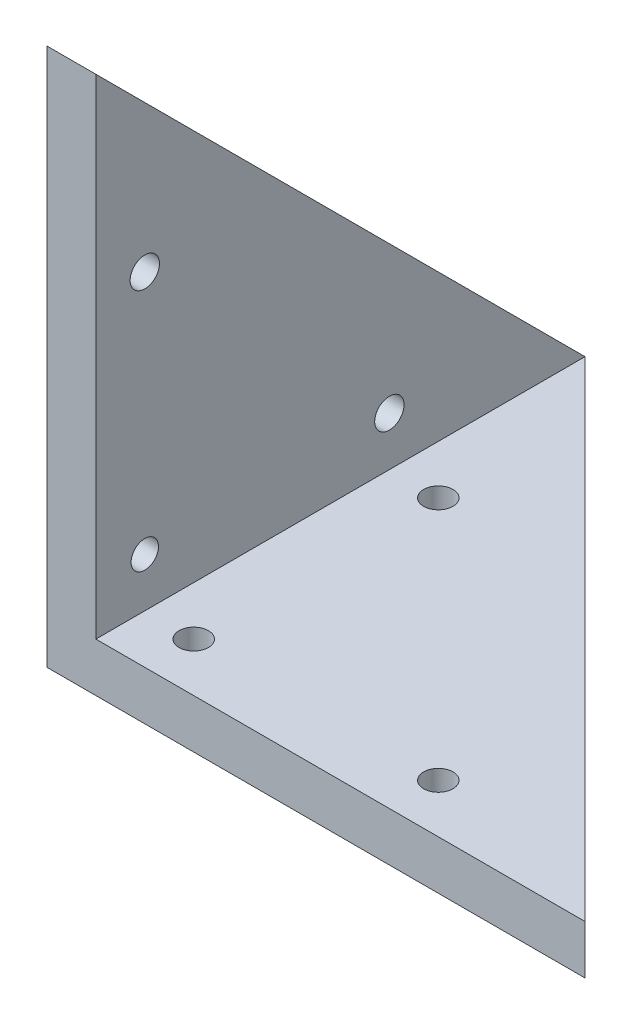
ISO-10303-21;
HEADER;
FILE_DESCRIPTION(('STEP AP214'),'2;1');
FILE_NAME('part.step','',(''),(''),'','','');
FILE_SCHEMA(('AUTOMOTIVE_DESIGN { 1 0 10303 214 1 1 1 1 }'));
ENDSEC;
DATA;
#1=APPLICATION_CONTEXT('core data for automotive mechanical design processes');
#2=APPLICATION_PROTOCOL_DEFINITION('international standard','automotive_design',2000,#1);
#3=PRODUCT_CONTEXT('',#1,'mechanical');
#4=PRODUCT('Part','Part','',(#3));
#5=PRODUCT_RELATED_PRODUCT_CATEGORY('part','',(#4));
#6=PRODUCT_DEFINITION_FORMATION('','',#4);
#7=PRODUCT_DEFINITION_CONTEXT('part definition',#1,'design');
#8=PRODUCT_DEFINITION('design','',#6,#7);
#9=PRODUCT_DEFINITION_SHAPE('','',#8);
#10=(LENGTH_UNIT() NAMED_UNIT(*) SI_UNIT(.MILLI.,.METRE.));
#11=(NAMED_UNIT(*) PLANE_ANGLE_UNIT() SI_UNIT($,.RADIAN.));
#12=(NAMED_UNIT(*) SI_UNIT($,.STERADIAN.) SOLID_ANGLE_UNIT());
#13=UNCERTAINTY_MEASURE_WITH_UNIT(LENGTH_MEASURE(1.E-05),#10,'distance_accuracy_value','');
#14=(GEOMETRIC_REPRESENTATION_CONTEXT(3) GLOBAL_UNCERTAINTY_ASSIGNED_CONTEXT((#13)) GLOBAL_UNIT_ASSIGNED_CONTEXT((#10,
#11,#12)) REPRESENTATION_CONTEXT('',''));
#15=CARTESIAN_POINT('',(0.,0.,0.));
#16=DIRECTION('',(0.,0.,1.));
#17=DIRECTION('',(1.,0.,0.));
#18=AXIS2_PLACEMENT_3D('',#15,#16,#17);
#19=CARTESIAN_POINT('',(-4.99999999999999,50.,5.));
#20=DIRECTION('',(1.,0.,0.));
#21=DIRECTION('',(0.,1.,0.));
#22=AXIS2_PLACEMENT_3D('',#19,#20,#21);
#23=PLANE('',#22);
#24=CARTESIAN_POINT('',(-5.,5.,-5.));
#25=DIRECTION('',(1.,0.,0.));
#26=DIRECTION('',(0.,0.,-1.));
#27=AXIS2_PLACEMENT_3D('',#24,#25,#26);
#28=CIRCLE('',#27,1.4);
#29=CARTESIAN_POINT('',(-5.,5.,-6.40000000000001));
#30=VERTEX_POINT('',#29);
#31=EDGE_CURVE('E129',#30,#30,#28,.T.);
#32=ORIENTED_EDGE('',*,*,#31,.T.);
#33=EDGE_LOOP('',(#32));
#34=FACE_BOUND('',#33,.T.);
#35=CARTESIAN_POINT('',(-5.,5.,-30.));
#36=DIRECTION('',(1.,0.,0.));
#37=DIRECTION('',(0.,0.,-1.));
#38=AXIS2_PLACEMENT_3D('',#35,#36,#37);
#39=CIRCLE('',#38,1.5);
#40=CARTESIAN_POINT('',(-5.,5.,-31.5));
#41=VERTEX_POINT('',#40);
#42=EDGE_CURVE('E135',#41,#41,#39,.T.);
#43=ORIENTED_EDGE('',*,*,#42,.T.);
#44=EDGE_LOOP('',(#43));
#45=FACE_BOUND('',#44,.T.);
#46=CARTESIAN_POINT('',(-5.,30.,-5.));
#47=DIRECTION('',(1.,0.,0.));
#48=DIRECTION('',(0.,0.,-1.));
#49=AXIS2_PLACEMENT_3D('',#46,#47,#48);
#50=CIRCLE('',#49,1.5);
#51=CARTESIAN_POINT('',(-5.,30.,-6.5));
#52=VERTEX_POINT('',#51);
#53=EDGE_CURVE('E140',#52,#52,#50,.T.);
#54=ORIENTED_EDGE('',*,*,#53,.T.);
#55=EDGE_LOOP('',(#54));
#56=FACE_BOUND('',#55,.T.);
#57=DIRECTION('',(0.,-1.,0.));
#58=VECTOR('',#57,1.);
#59=CARTESIAN_POINT('',(-4.99999999999999,50.,0.));
#60=LINE('',#59,#58);
#61=CARTESIAN_POINT('',(-4.99999999999999,50.,0.));
#62=VERTEX_POINT('',#61);
#63=CARTESIAN_POINT('',(-4.99999999999998,-5.,0.));
#64=VERTEX_POINT('',#63);
#65=EDGE_CURVE('E80',#62,#64,#60,.T.);
#66=ORIENTED_EDGE('',*,*,#65,.F.);
#67=DIRECTION('',(0.,0.707106781186547,0.707106781186547));
#68=VECTOR('',#67,1.);
#69=CARTESIAN_POINT('',(-5.,0.,-50.));
#70=LINE('',#69,#68);
#71=CARTESIAN_POINT('',(-5.,0.,-50.));
#72=VERTEX_POINT('',#71);
#73=EDGE_CURVE('E92',#72,#62,#70,.T.);
#74=ORIENTED_EDGE('',*,*,#73,.F.);
#75=DIRECTION('',(0.,-1.,0.));
#76=VECTOR('',#75,1.);
#77=CARTESIAN_POINT('',(-5.,0.,-50.));
#78=LINE('',#77,#76);
#79=CARTESIAN_POINT('',(-5.,-5.,-50.));
#80=VERTEX_POINT('',#79);
#81=EDGE_CURVE('E128',#72,#80,#78,.T.);
#82=ORIENTED_EDGE('',*,*,#81,.T.);
#83=DIRECTION('',(0.,0.,-1.));
#84=VECTOR('',#83,1.);
#85=CARTESIAN_POINT('',(-4.99999999999998,-5.,5.));
#86=LINE('',#85,#84);
#87=EDGE_CURVE('E11',#64,#80,#86,.T.);
#88=ORIENTED_EDGE('',*,*,#87,.F.);
#89=EDGE_LOOP('',(#66,#74,#82,#88));
#90=FACE_BOUND('',#89,.T.);
#91=ADVANCED_FACE('F33',(#34,#45,#56,#90),#23,.F.);
#92=CARTESIAN_POINT('',(-4.99999999999998,-5.,5.));
#93=DIRECTION('',(0.,1.,0.));
#94=DIRECTION('',(0.,0.,1.));
#95=AXIS2_PLACEMENT_3D('',#92,#93,#94);
#96=PLANE('',#95);
#97=CARTESIAN_POINT('',(30.,-5.,-5.));
#98=DIRECTION('',(0.,1.,0.));
#99=DIRECTION('',(0.,0.,1.));
#100=AXIS2_PLACEMENT_3D('',#97,#98,#99);
#101=CIRCLE('',#100,1.50000000000001);
#102=CARTESIAN_POINT('',(30.,-5.,-3.49999999999999));
#103=VERTEX_POINT('',#102);
#104=EDGE_CURVE('E152',#103,#103,#101,.T.);
#105=ORIENTED_EDGE('',*,*,#104,.T.);
#106=EDGE_LOOP('',(#105));
#107=FACE_BOUND('',#106,.T.);
#108=CARTESIAN_POINT('',(5.,-5.,-5.));
#109=DIRECTION('',(0.,1.,0.));
#110=DIRECTION('',(0.,0.,1.));
#111=AXIS2_PLACEMENT_3D('',#108,#109,#110);
#112=CIRCLE('',#111,1.5);
#113=CARTESIAN_POINT('',(5.,-5.,-3.5));
#114=VERTEX_POINT('',#113);
#115=EDGE_CURVE('E158',#114,#114,#112,.T.);
#116=ORIENTED_EDGE('',*,*,#115,.T.);
#117=EDGE_LOOP('',(#116));
#118=FACE_BOUND('',#117,.T.);
#119=CARTESIAN_POINT('',(5.,-5.,-30.));
#120=DIRECTION('',(0.,1.,0.));
#121=DIRECTION('',(0.,0.,1.));
#122=AXIS2_PLACEMENT_3D('',#119,#120,#121);
#123=CIRCLE('',#122,1.5);
#124=CARTESIAN_POINT('',(5.,-5.,-28.5));
#125=VERTEX_POINT('',#124);
#126=EDGE_CURVE('E141',#125,#125,#123,.T.);
#127=ORIENTED_EDGE('',*,*,#126,.T.);
#128=EDGE_LOOP('',(#127));
#129=FACE_BOUND('',#128,.T.);
#130=DIRECTION('',(1.,0.,0.));
#131=VECTOR('',#130,1.);
#132=CARTESIAN_POINT('',(-4.99999999999998,-5.,0.));
#133=LINE('',#132,#131);
#134=CARTESIAN_POINT('',(50.,-5.,0.));
#135=VERTEX_POINT('',#134);
#136=EDGE_CURVE('E94',#64,#135,#133,.T.);
#137=ORIENTED_EDGE('',*,*,#136,.F.);
#138=ORIENTED_EDGE('',*,*,#87,.T.);
#139=DIRECTION('',(1.,0.,0.));
#140=VECTOR('',#139,1.);
#141=CARTESIAN_POINT('',(-5.,-5.,-50.));
#142=LINE('',#141,#140);
#143=CARTESIAN_POINT('',(0.,-5.,-50.));
#144=VERTEX_POINT('',#143);
#145=EDGE_CURVE('E105',#80,#144,#142,.T.);
#146=ORIENTED_EDGE('',*,*,#145,.T.);
#147=DIRECTION('',(0.707106781186547,0.,0.707106781186547));
#148=VECTOR('',#147,1.);
#149=CARTESIAN_POINT('',(0.,-5.,-50.));
#150=LINE('',#149,#148);
#151=EDGE_CURVE('E55',#144,#135,#150,.T.);
#152=ORIENTED_EDGE('',*,*,#151,.T.);
#153=EDGE_LOOP('',(#137,#138,#146,#152));
#154=FACE_BOUND('',#153,.T.);
#155=ADVANCED_FACE('F168',(#107,#118,#129,#154),#96,.F.);
#156=CARTESIAN_POINT('',(0.,0.,-50.));
#157=DIRECTION('',(0.707106781186548,0.,-0.707106781186548));
#158=DIRECTION('',(-0.707106781186548,0.,-0.707106781186548));
#159=AXIS2_PLACEMENT_3D('',#156,#157,#158);
#160=PLANE('',#159);
#161=ORIENTED_EDGE('',*,*,#151,.F.);
#162=DIRECTION('',(0.,-1.,0.));
#163=VECTOR('',#162,1.);
#164=CARTESIAN_POINT('',(0.,0.,-50.));
#165=LINE('',#164,#163);
#166=CARTESIAN_POINT('',(0.,0.,-50.));
#167=VERTEX_POINT('',#166);
#168=EDGE_CURVE('E86',#167,#144,#165,.T.);
#169=ORIENTED_EDGE('',*,*,#168,.F.);
#170=DIRECTION('',(0.707106781186547,0.,0.707106781186547));
#171=VECTOR('',#170,1.);
#172=CARTESIAN_POINT('',(0.,0.,-50.));
#173=LINE('',#172,#171);
#174=CARTESIAN_POINT('',(50.,0.,0.));
#175=VERTEX_POINT('',#174);
#176=EDGE_CURVE('E108',#167,#175,#173,.T.);
#177=ORIENTED_EDGE('',*,*,#176,.T.);
#178=DIRECTION('',(0.,1.,0.));
#179=VECTOR('',#178,1.);
#180=CARTESIAN_POINT('',(50.,-5.,0.));
#181=LINE('',#180,#179);
#182=EDGE_CURVE('E40',#135,#175,#181,.T.);
#183=ORIENTED_EDGE('',*,*,#182,.F.);
#184=EDGE_LOOP('',(#161,#169,#177,#183));
#185=FACE_BOUND('',#184,.T.);
#186=ADVANCED_FACE('F121',(#185),#160,.T.);
#187=CARTESIAN_POINT('',(0.,0.,0.));
#188=DIRECTION('',(0.,-1.,0.));
#189=DIRECTION('',(0.,0.,-1.));
#190=AXIS2_PLACEMENT_3D('',#187,#188,#189);
#191=PLANE('',#190);
#192=CARTESIAN_POINT('',(5.,0.,-30.));
#193=DIRECTION('',(0.,1.,0.));
#194=DIRECTION('',(0.,0.,1.));
#195=AXIS2_PLACEMENT_3D('',#192,#193,#194);
#196=CIRCLE('',#195,1.5);
#197=CARTESIAN_POINT('',(5.,0.,-28.5));
#198=VERTEX_POINT('',#197);
#199=EDGE_CURVE('E161',#198,#198,#196,.T.);
#200=ORIENTED_EDGE('',*,*,#199,.F.);
#201=EDGE_LOOP('',(#200));
#202=FACE_BOUND('',#201,.T.);
#203=CARTESIAN_POINT('',(5.,0.,-5.));
#204=DIRECTION('',(0.,1.,0.));
#205=DIRECTION('',(0.,0.,1.));
#206=AXIS2_PLACEMENT_3D('',#203,#204,#205);
#207=CIRCLE('',#206,1.5);
#208=CARTESIAN_POINT('',(5.,0.,-3.5));
#209=VERTEX_POINT('',#208);
#210=EDGE_CURVE('E155',#209,#209,#207,.T.);
#211=ORIENTED_EDGE('',*,*,#210,.F.);
#212=EDGE_LOOP('',(#211));
#213=FACE_BOUND('',#212,.T.);
#214=CARTESIAN_POINT('',(30.,0.,-5.));
#215=DIRECTION('',(0.,1.,0.));
#216=DIRECTION('',(0.,0.,1.));
#217=AXIS2_PLACEMENT_3D('',#214,#215,#216);
#218=CIRCLE('',#217,1.50000000000001);
#219=CARTESIAN_POINT('',(30.,0.,-3.49999999999999));
#220=VERTEX_POINT('',#219);
#221=EDGE_CURVE('E149',#220,#220,#218,.T.);
#222=ORIENTED_EDGE('',*,*,#221,.F.);
#223=EDGE_LOOP('',(#222));
#224=FACE_BOUND('',#223,.T.);
#225=ORIENTED_EDGE('',*,*,#176,.F.);
#226=DIRECTION('',(0.,0.,-1.));
#227=VECTOR('',#226,1.);
#228=CARTESIAN_POINT('',(0.,0.,0.));
#229=LINE('',#228,#227);
#230=CARTESIAN_POINT('',(0.,0.,0.));
#231=VERTEX_POINT('',#230);
#232=EDGE_CURVE('E113',#231,#167,#229,.T.);
#233=ORIENTED_EDGE('',*,*,#232,.F.);
#234=DIRECTION('',(-1.,0.,0.));
#235=VECTOR('',#234,1.);
#236=CARTESIAN_POINT('',(50.,0.,0.));
#237=LINE('',#236,#235);
#238=EDGE_CURVE('E111',#175,#231,#237,.T.);
#239=ORIENTED_EDGE('',*,*,#238,.F.);
#240=EDGE_LOOP('',(#225,#233,#239));
#241=FACE_BOUND('',#240,.T.);
#242=ADVANCED_FACE('F120',(#202,#213,#224,#241),#191,.F.);
#243=CARTESIAN_POINT('',(0.,0.,0.));
#244=DIRECTION('',(1.,0.,0.));
#245=DIRECTION('',(0.,0.,-1.));
#246=AXIS2_PLACEMENT_3D('',#243,#244,#245);
#247=PLANE('',#246);
#248=CARTESIAN_POINT('',(0.,30.,-5.));
#249=DIRECTION('',(1.,0.,0.));
#250=DIRECTION('',(0.,0.,-1.));
#251=AXIS2_PLACEMENT_3D('',#248,#249,#250);
#252=CIRCLE('',#251,1.5);
#253=CARTESIAN_POINT('',(0.,30.,-6.5));
#254=VERTEX_POINT('',#253);
#255=EDGE_CURVE('E137',#254,#254,#252,.T.);
#256=ORIENTED_EDGE('',*,*,#255,.F.);
#257=EDGE_LOOP('',(#256));
#258=FACE_BOUND('',#257,.T.);
#259=CARTESIAN_POINT('',(0.,5.,-30.));
#260=DIRECTION('',(1.,0.,0.));
#261=DIRECTION('',(0.,0.,-1.));
#262=AXIS2_PLACEMENT_3D('',#259,#260,#261);
#263=CIRCLE('',#262,1.5);
#264=CARTESIAN_POINT('',(0.,5.,-31.5));
#265=VERTEX_POINT('',#264);
#266=EDGE_CURVE('E144',#265,#265,#263,.T.);
#267=ORIENTED_EDGE('',*,*,#266,.F.);
#268=EDGE_LOOP('',(#267));
#269=FACE_BOUND('',#268,.T.);
#270=CARTESIAN_POINT('',(0.,5.,-5.));
#271=DIRECTION('',(1.,0.,0.));
#272=DIRECTION('',(0.,0.,-1.));
#273=AXIS2_PLACEMENT_3D('',#270,#271,#272);
#274=CIRCLE('',#273,1.4);
#275=CARTESIAN_POINT('',(0.,5.,-6.40000000000001));
#276=VERTEX_POINT('',#275);
#277=EDGE_CURVE('E131',#276,#276,#274,.T.);
#278=ORIENTED_EDGE('',*,*,#277,.F.);
#279=EDGE_LOOP('',(#278));
#280=FACE_BOUND('',#279,.T.);
#281=ORIENTED_EDGE('',*,*,#232,.T.);
#282=DIRECTION('',(0.,0.707106781186547,0.707106781186547));
#283=VECTOR('',#282,1.);
#284=CARTESIAN_POINT('',(0.,0.,-50.));
#285=LINE('',#284,#283);
#286=CARTESIAN_POINT('',(0.,50.,0.));
#287=VERTEX_POINT('',#286);
#288=EDGE_CURVE('E99',#167,#287,#285,.T.);
#289=ORIENTED_EDGE('',*,*,#288,.T.);
#290=DIRECTION('',(0.,-1.,0.));
#291=VECTOR('',#290,1.);
#292=CARTESIAN_POINT('',(0.,50.,0.));
#293=LINE('',#292,#291);
#294=EDGE_CURVE('E47',#287,#231,#293,.T.);
#295=ORIENTED_EDGE('',*,*,#294,.T.);
#296=EDGE_LOOP('',(#281,#289,#295));
#297=FACE_BOUND('',#296,.T.);
#298=ADVANCED_FACE('F126',(#258,#269,#280,#297),#247,.T.);
#299=CARTESIAN_POINT('',(-5.,0.,-50.));
#300=DIRECTION('',(0.,0.707106781186548,-0.707106781186548));
#301=DIRECTION('',(0.,0.707106781186548,0.707106781186548));
#302=AXIS2_PLACEMENT_3D('',#299,#300,#301);
#303=PLANE('',#302);
#304=ORIENTED_EDGE('',*,*,#288,.F.);
#305=DIRECTION('',(1.,0.,0.));
#306=VECTOR('',#305,1.);
#307=CARTESIAN_POINT('',(-5.,0.,-50.));
#308=LINE('',#307,#306);
#309=EDGE_CURVE('E98',#72,#167,#308,.T.);
#310=ORIENTED_EDGE('',*,*,#309,.F.);
#311=ORIENTED_EDGE('',*,*,#73,.T.);
#312=DIRECTION('',(-1.,0.,0.));
#313=VECTOR('',#312,1.);
#314=CARTESIAN_POINT('',(0.,50.,0.));
#315=LINE('',#314,#313);
#316=EDGE_CURVE('E77',#287,#62,#315,.T.);
#317=ORIENTED_EDGE('',*,*,#316,.F.);
#318=EDGE_LOOP('',(#304,#310,#311,#317));
#319=FACE_BOUND('',#318,.T.);
#320=ADVANCED_FACE('F96',(#319),#303,.T.);
#321=CARTESIAN_POINT('',(0.,0.,-50.));
#322=DIRECTION('',(0.,0.,1.));
#323=DIRECTION('',(1.,0.,0.));
#324=AXIS2_PLACEMENT_3D('',#321,#322,#323);
#325=PLANE('',#324);
#326=ORIENTED_EDGE('',*,*,#81,.F.);
#327=ORIENTED_EDGE('',*,*,#309,.T.);
#328=ORIENTED_EDGE('',*,*,#168,.T.);
#329=ORIENTED_EDGE('',*,*,#145,.F.);
#330=EDGE_LOOP('',(#326,#327,#328,#329));
#331=FACE_BOUND('',#330,.T.);
#332=ADVANCED_FACE('F127',(#331),#325,.F.);
#333=CARTESIAN_POINT('',(-5.,5.,-5.));
#334=DIRECTION('',(1.,0.,0.));
#335=DIRECTION('',(0.,0.,-1.));
#336=AXIS2_PLACEMENT_3D('',#333,#334,#335);
#337=CYLINDRICAL_SURFACE('',#336,1.4);
#338=ORIENTED_EDGE('',*,*,#31,.F.);
#339=EDGE_LOOP('',(#338));
#340=FACE_BOUND('',#339,.T.);
#341=ORIENTED_EDGE('',*,*,#277,.T.);
#342=EDGE_LOOP('',(#341));
#343=FACE_BOUND('',#342,.T.);
#344=ADVANCED_FACE('F222',(#340,#343),#337,.F.);
#345=CARTESIAN_POINT('',(-5.,5.,-30.));
#346=DIRECTION('',(1.,0.,0.));
#347=DIRECTION('',(0.,0.,-1.));
#348=AXIS2_PLACEMENT_3D('',#345,#346,#347);
#349=CYLINDRICAL_SURFACE('',#348,1.5);
#350=ORIENTED_EDGE('',*,*,#42,.F.);
#351=EDGE_LOOP('',(#350));
#352=FACE_BOUND('',#351,.T.);
#353=ORIENTED_EDGE('',*,*,#266,.T.);
#354=EDGE_LOOP('',(#353));
#355=FACE_BOUND('',#354,.T.);
#356=ADVANCED_FACE('F196',(#352,#355),#349,.F.);
#357=CARTESIAN_POINT('',(-5.,30.,-5.));
#358=DIRECTION('',(1.,0.,0.));
#359=DIRECTION('',(0.,0.,-1.));
#360=AXIS2_PLACEMENT_3D('',#357,#358,#359);
#361=CYLINDRICAL_SURFACE('',#360,1.5);
#362=ORIENTED_EDGE('',*,*,#53,.F.);
#363=EDGE_LOOP('',(#362));
#364=FACE_BOUND('',#363,.T.);
#365=ORIENTED_EDGE('',*,*,#255,.T.);
#366=EDGE_LOOP('',(#365));
#367=FACE_BOUND('',#366,.T.);
#368=ADVANCED_FACE('F187',(#364,#367),#361,.F.);
#369=CARTESIAN_POINT('',(30.,-5.,-5.));
#370=DIRECTION('',(0.,1.,0.));
#371=DIRECTION('',(0.,0.,1.));
#372=AXIS2_PLACEMENT_3D('',#369,#370,#371);
#373=CYLINDRICAL_SURFACE('',#372,1.50000000000001);
#374=ORIENTED_EDGE('',*,*,#104,.F.);
#375=EDGE_LOOP('',(#374));
#376=FACE_BOUND('',#375,.T.);
#377=ORIENTED_EDGE('',*,*,#221,.T.);
#378=EDGE_LOOP('',(#377));
#379=FACE_BOUND('',#378,.T.);
#380=ADVANCED_FACE('F185',(#376,#379),#373,.F.);
#381=CARTESIAN_POINT('',(5.,-5.,-5.));
#382=DIRECTION('',(0.,1.,0.));
#383=DIRECTION('',(0.,0.,1.));
#384=AXIS2_PLACEMENT_3D('',#381,#382,#383);
#385=CYLINDRICAL_SURFACE('',#384,1.5);
#386=ORIENTED_EDGE('',*,*,#115,.F.);
#387=EDGE_LOOP('',(#386));
#388=FACE_BOUND('',#387,.T.);
#389=ORIENTED_EDGE('',*,*,#210,.T.);
#390=EDGE_LOOP('',(#389));
#391=FACE_BOUND('',#390,.T.);
#392=ADVANCED_FACE('F174',(#388,#391),#385,.F.);
#393=CARTESIAN_POINT('',(5.,-5.,-30.));
#394=DIRECTION('',(0.,1.,0.));
#395=DIRECTION('',(0.,0.,1.));
#396=AXIS2_PLACEMENT_3D('',#393,#394,#395);
#397=CYLINDRICAL_SURFACE('',#396,1.5);
#398=ORIENTED_EDGE('',*,*,#126,.F.);
#399=EDGE_LOOP('',(#398));
#400=FACE_BOUND('',#399,.T.);
#401=ORIENTED_EDGE('',*,*,#199,.T.);
#402=EDGE_LOOP('',(#401));
#403=FACE_BOUND('',#402,.T.);
#404=ADVANCED_FACE('F171',(#400,#403),#397,.F.);
#405=CARTESIAN_POINT('',(0.,0.,0.));
#406=DIRECTION('',(0.,0.,1.));
#407=DIRECTION('',(1.,0.,0.));
#408=AXIS2_PLACEMENT_3D('',#405,#406,#407);
#409=PLANE('',#408);
#410=ORIENTED_EDGE('',*,*,#238,.T.);
#411=ORIENTED_EDGE('',*,*,#294,.F.);
#412=ORIENTED_EDGE('',*,*,#316,.T.);
#413=ORIENTED_EDGE('',*,*,#65,.T.);
#414=ORIENTED_EDGE('',*,*,#136,.T.);
#415=ORIENTED_EDGE('',*,*,#182,.T.);
#416=EDGE_LOOP('',(#410,#411,#412,#413,#414,#415));
#417=FACE_BOUND('',#416,.T.);
#418=ADVANCED_FACE('F79',(#417),#409,.T.);
#419=CLOSED_SHELL('',(#91,#155,#186,#242,#298,#320,#332,#344,#356,#368,#380,#392,#404,#418));
#420=MANIFOLD_SOLID_BREP('B2',#419);
#421=ADVANCED_BREP_SHAPE_REPRESENTATION('',(#18,#420),#14);
#422=SHAPE_DEFINITION_REPRESENTATION(#9,#421);
ENDSEC;
END-ISO-10303-21;
